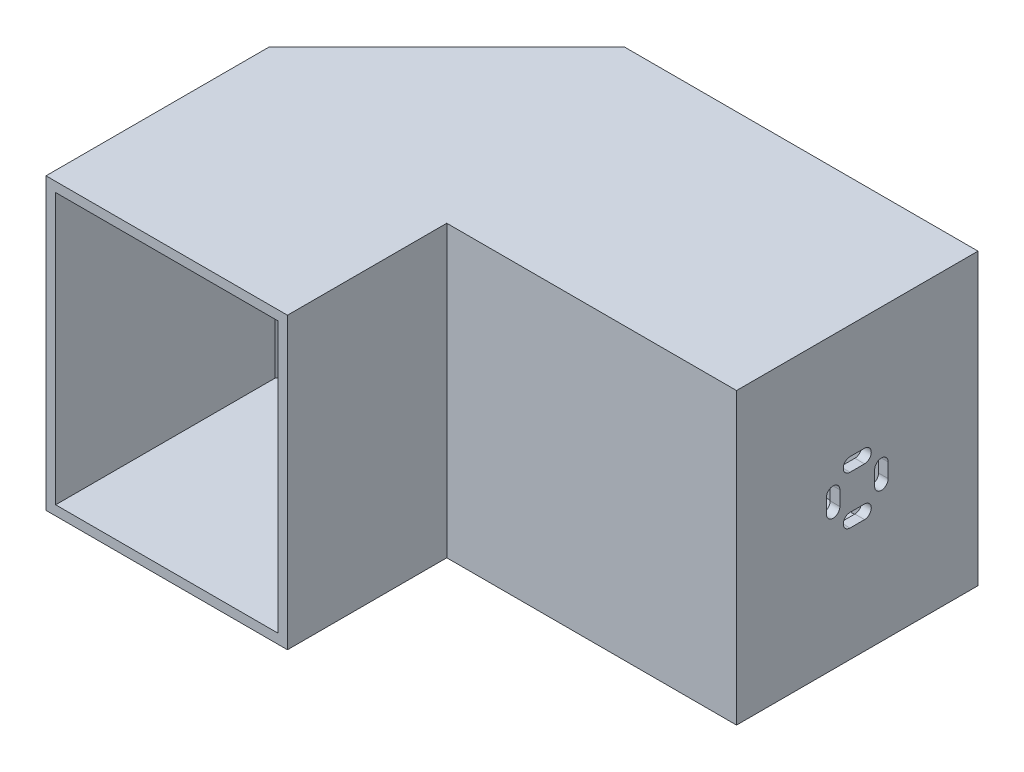
ISO-10303-21;
HEADER;
FILE_DESCRIPTION(('STEP AP214'),'2;1');
FILE_NAME('part.step','',(''),(''),'','','');
FILE_SCHEMA(('AUTOMOTIVE_DESIGN { 1 0 10303 214 1 1 1 1 }'));
ENDSEC;
DATA;
#1=APPLICATION_CONTEXT('core data for automotive mechanical design processes');
#2=APPLICATION_PROTOCOL_DEFINITION('international standard','automotive_design',2000,#1);
#3=PRODUCT_CONTEXT('',#1,'mechanical');
#4=PRODUCT('Part','Part','',(#3));
#5=PRODUCT_RELATED_PRODUCT_CATEGORY('part','',(#4));
#6=PRODUCT_DEFINITION_FORMATION('','',#4);
#7=PRODUCT_DEFINITION_CONTEXT('part definition',#1,'design');
#8=PRODUCT_DEFINITION('design','',#6,#7);
#9=PRODUCT_DEFINITION_SHAPE('','',#8);
#10=(LENGTH_UNIT() NAMED_UNIT(*) SI_UNIT(.MILLI.,.METRE.));
#11=(NAMED_UNIT(*) PLANE_ANGLE_UNIT() SI_UNIT($,.RADIAN.));
#12=(NAMED_UNIT(*) SI_UNIT($,.STERADIAN.) SOLID_ANGLE_UNIT());
#13=UNCERTAINTY_MEASURE_WITH_UNIT(LENGTH_MEASURE(1.E-05),#10,'distance_accuracy_value','');
#14=(GEOMETRIC_REPRESENTATION_CONTEXT(3) GLOBAL_UNCERTAINTY_ASSIGNED_CONTEXT((#13)) GLOBAL_UNIT_ASSIGNED_CONTEXT((#10,
#11,#12)) REPRESENTATION_CONTEXT('',''));
#15=CARTESIAN_POINT('',(0.,0.,0.));
#16=DIRECTION('',(0.,0.,1.));
#17=DIRECTION('',(1.,0.,0.));
#18=AXIS2_PLACEMENT_3D('',#15,#16,#17);
#19=CARTESIAN_POINT('',(0.,76.2,41.8923125117075));
#20=DIRECTION('',(0.,0.,-1.));
#21=DIRECTION('',(-1.,0.,0.));
#22=AXIS2_PLACEMENT_3D('',#19,#20,#21);
#23=PLANE('',#22);
#24=DIRECTION('',(1.,0.,0.));
#25=VECTOR('',#24,1.);
#26=CARTESIAN_POINT('',(0.,0.,41.8923125117075));
#27=LINE('',#26,#25);
#28=CARTESIAN_POINT('',(-63.5,0.,41.8923125117075));
#29=VERTEX_POINT('',#28);
#30=CARTESIAN_POINT('',(0.,0.,41.8923125117075));
#31=VERTEX_POINT('',#30);
#32=EDGE_CURVE('E445',#29,#31,#27,.T.);
#33=ORIENTED_EDGE('',*,*,#32,.T.);
#34=DIRECTION('',(0.,-1.,0.));
#35=VECTOR('',#34,1.);
#36=CARTESIAN_POINT('',(0.,76.2,41.8923125117075));
#37=LINE('',#36,#35);
#38=CARTESIAN_POINT('',(0.,76.2,41.8923125117075));
#39=VERTEX_POINT('',#38);
#40=EDGE_CURVE('E450',#39,#31,#37,.T.);
#41=ORIENTED_EDGE('',*,*,#40,.F.);
#42=DIRECTION('',(1.,0.,0.));
#43=VECTOR('',#42,1.);
#44=CARTESIAN_POINT('',(0.,76.2,41.8923125117075));
#45=LINE('',#44,#43);
#46=CARTESIAN_POINT('',(-63.5,76.2,41.8923125117075));
#47=VERTEX_POINT('',#46);
#48=EDGE_CURVE('E430',#47,#39,#45,.T.);
#49=ORIENTED_EDGE('',*,*,#48,.F.);
#50=DIRECTION('',(0.,-1.,0.));
#51=VECTOR('',#50,1.);
#52=CARTESIAN_POINT('',(-63.5,76.2,41.8923125117075));
#53=LINE('',#52,#51);
#54=EDGE_CURVE('E453',#47,#29,#53,.T.);
#55=ORIENTED_EDGE('',*,*,#54,.T.);
#56=EDGE_LOOP('',(#33,#41,#49,#55));
#57=FACE_BOUND('',#56,.T.);
#58=DIRECTION('',(1.,0.,0.));
#59=VECTOR('',#58,1.);
#60=CARTESIAN_POINT('',(0.,2.54,41.8923125117075));
#61=LINE('',#60,#59);
#62=CARTESIAN_POINT('',(-60.96,2.54,41.8923125117075));
#63=VERTEX_POINT('',#62);
#64=CARTESIAN_POINT('',(-2.53999999999997,2.54,41.8923125117075));
#65=VERTEX_POINT('',#64);
#66=EDGE_CURVE('E405',#63,#65,#61,.T.);
#67=ORIENTED_EDGE('',*,*,#66,.F.);
#68=DIRECTION('',(0.,-1.,0.));
#69=VECTOR('',#68,1.);
#70=CARTESIAN_POINT('',(-60.96,76.2,41.8923125117075));
#71=LINE('',#70,#69);
#72=CARTESIAN_POINT('',(-60.96,73.66,41.8923125117075));
#73=VERTEX_POINT('',#72);
#74=EDGE_CURVE('E401',#73,#63,#71,.T.);
#75=ORIENTED_EDGE('',*,*,#74,.F.);
#76=DIRECTION('',(1.,0.,0.));
#77=VECTOR('',#76,1.);
#78=CARTESIAN_POINT('',(0.,73.66,41.8923125117075));
#79=LINE('',#78,#77);
#80=CARTESIAN_POINT('',(-2.53999999999997,73.66,41.8923125117075));
#81=VERTEX_POINT('',#80);
#82=EDGE_CURVE('E408',#73,#81,#79,.T.);
#83=ORIENTED_EDGE('',*,*,#82,.T.);
#84=DIRECTION('',(0.,-1.,0.));
#85=VECTOR('',#84,1.);
#86=CARTESIAN_POINT('',(-2.53999999999997,76.2,41.8923125117075));
#87=LINE('',#86,#85);
#88=EDGE_CURVE('E381',#81,#65,#87,.T.);
#89=ORIENTED_EDGE('',*,*,#88,.T.);
#90=EDGE_LOOP('',(#67,#75,#83,#89));
#91=FACE_BOUND('',#90,.T.);
#92=ADVANCED_FACE('F35',(#57,#91),#23,.F.);
#93=CARTESIAN_POINT('',(76.2,76.2,0.));
#94=DIRECTION('',(0.,0.,-1.));
#95=DIRECTION('',(-1.,0.,0.));
#96=AXIS2_PLACEMENT_3D('',#93,#94,#95);
#97=PLANE('',#96);
#98=DIRECTION('',(1.,0.,0.));
#99=VECTOR('',#98,1.);
#100=CARTESIAN_POINT('',(76.2,0.,0.));
#101=LINE('',#100,#99);
#102=CARTESIAN_POINT('',(0.,0.,0.));
#103=VERTEX_POINT('',#102);
#104=CARTESIAN_POINT('',(76.2,0.,0.));
#105=VERTEX_POINT('',#104);
#106=EDGE_CURVE('E371',#103,#105,#101,.T.);
#107=ORIENTED_EDGE('',*,*,#106,.T.);
#108=DIRECTION('',(0.,-1.,0.));
#109=VECTOR('',#108,1.);
#110=CARTESIAN_POINT('',(76.2,76.2,0.));
#111=LINE('',#110,#109);
#112=CARTESIAN_POINT('',(76.2,76.2,0.));
#113=VERTEX_POINT('',#112);
#114=EDGE_CURVE('E11',#113,#105,#111,.T.);
#115=ORIENTED_EDGE('',*,*,#114,.F.);
#116=DIRECTION('',(1.,0.,0.));
#117=VECTOR('',#116,1.);
#118=CARTESIAN_POINT('',(76.2,76.2,0.));
#119=LINE('',#118,#117);
#120=CARTESIAN_POINT('',(0.,76.2,0.));
#121=VERTEX_POINT('',#120);
#122=EDGE_CURVE('E418',#121,#113,#119,.T.);
#123=ORIENTED_EDGE('',*,*,#122,.F.);
#124=DIRECTION('',(0.,-1.,0.));
#125=VECTOR('',#124,1.);
#126=CARTESIAN_POINT('',(0.,76.2,0.));
#127=LINE('',#126,#125);
#128=EDGE_CURVE('E434',#121,#103,#127,.T.);
#129=ORIENTED_EDGE('',*,*,#128,.T.);
#130=EDGE_LOOP('',(#107,#115,#123,#129));
#131=FACE_BOUND('',#130,.T.);
#132=ADVANCED_FACE('F37',(#131),#97,.F.);
#133=CARTESIAN_POINT('',(76.2,76.2,-63.5));
#134=DIRECTION('',(-1.,0.,0.));
#135=DIRECTION('',(0.,0.,1.));
#136=AXIS2_PLACEMENT_3D('',#133,#134,#135);
#137=PLANE('',#136);
#138=DIRECTION('',(0.,-1.,0.));
#139=VECTOR('',#138,1.);
#140=CARTESIAN_POINT('',(76.2,40.005,-36.322));
#141=LINE('',#140,#139);
#142=CARTESIAN_POINT('',(76.2,40.005,-36.322));
#143=VERTEX_POINT('',#142);
#144=CARTESIAN_POINT('',(76.2,36.1950000000001,-36.322));
#145=VERTEX_POINT('',#144);
#146=EDGE_CURVE('E259',#143,#145,#141,.T.);
#147=ORIENTED_EDGE('',*,*,#146,.F.);
#148=CARTESIAN_POINT('',(76.2,40.0050000000001,-38.1));
#149=DIRECTION('',(1.,0.,0.));
#150=DIRECTION('',(0.,-1.,0.));
#151=AXIS2_PLACEMENT_3D('',#148,#149,#150);
#152=CIRCLE('',#151,1.778);
#153=CARTESIAN_POINT('',(76.2,40.0050000000001,-39.878));
#154=VERTEX_POINT('',#153);
#155=EDGE_CURVE('E50',#154,#143,#152,.T.);
#156=ORIENTED_EDGE('',*,*,#155,.F.);
#157=DIRECTION('',(0.,1.,0.));
#158=VECTOR('',#157,1.);
#159=CARTESIAN_POINT('',(76.2,40.0050000000001,-39.878));
#160=LINE('',#159,#158);
#161=CARTESIAN_POINT('',(76.2,36.1950000000001,-39.878));
#162=VERTEX_POINT('',#161);
#163=EDGE_CURVE('E250',#162,#154,#160,.T.);
#164=ORIENTED_EDGE('',*,*,#163,.F.);
#165=CARTESIAN_POINT('',(76.2,36.1950000000001,-38.1));
#166=DIRECTION('',(1.,0.,0.));
#167=DIRECTION('',(0.,-1.,0.));
#168=AXIS2_PLACEMENT_3D('',#165,#166,#167);
#169=CIRCLE('',#168,1.778);
#170=EDGE_CURVE('E253',#145,#162,#169,.T.);
#171=ORIENTED_EDGE('',*,*,#170,.F.);
#172=EDGE_LOOP('',(#147,#156,#164,#171));
#173=FACE_BOUND('',#172,.T.);
#174=DIRECTION('',(0.,0.,1.));
#175=VECTOR('',#174,1.);
#176=CARTESIAN_POINT('',(76.2,33.528,-33.655));
#177=LINE('',#176,#175);
#178=CARTESIAN_POINT('',(76.2,33.528,-33.655));
#179=VERTEX_POINT('',#178);
#180=CARTESIAN_POINT('',(76.2,33.528,-29.845));
#181=VERTEX_POINT('',#180);
#182=EDGE_CURVE('E284',#179,#181,#177,.T.);
#183=ORIENTED_EDGE('',*,*,#182,.F.);
#184=CARTESIAN_POINT('',(76.2,31.75,-33.655));
#185=DIRECTION('',(1.,0.,0.));
#186=DIRECTION('',(0.,0.,1.));
#187=AXIS2_PLACEMENT_3D('',#184,#185,#186);
#188=CIRCLE('',#187,1.778);
#189=CARTESIAN_POINT('',(76.2,29.972,-33.655));
#190=VERTEX_POINT('',#189);
#191=EDGE_CURVE('E265',#190,#179,#188,.T.);
#192=ORIENTED_EDGE('',*,*,#191,.F.);
#193=DIRECTION('',(0.,0.,-1.));
#194=VECTOR('',#193,1.);
#195=CARTESIAN_POINT('',(76.2,29.972,-33.655));
#196=LINE('',#195,#194);
#197=CARTESIAN_POINT('',(76.2,29.972,-29.845));
#198=VERTEX_POINT('',#197);
#199=EDGE_CURVE('E273',#198,#190,#196,.T.);
#200=ORIENTED_EDGE('',*,*,#199,.F.);
#201=CARTESIAN_POINT('',(76.2,31.75,-29.845));
#202=DIRECTION('',(1.,0.,0.));
#203=DIRECTION('',(0.,0.,1.));
#204=AXIS2_PLACEMENT_3D('',#201,#202,#203);
#205=CIRCLE('',#204,1.778);
#206=EDGE_CURVE('E287',#181,#198,#205,.T.);
#207=ORIENTED_EDGE('',*,*,#206,.F.);
#208=EDGE_LOOP('',(#183,#192,#200,#207));
#209=FACE_BOUND('',#208,.T.);
#210=DIRECTION('',(0.,1.,0.));
#211=VECTOR('',#210,1.);
#212=CARTESIAN_POINT('',(76.2,36.195,-27.178));
#213=LINE('',#212,#211);
#214=CARTESIAN_POINT('',(76.2,36.195,-27.178));
#215=VERTEX_POINT('',#214);
#216=CARTESIAN_POINT('',(76.2,40.005,-27.178));
#217=VERTEX_POINT('',#216);
#218=EDGE_CURVE('E316',#215,#217,#213,.T.);
#219=ORIENTED_EDGE('',*,*,#218,.F.);
#220=CARTESIAN_POINT('',(76.2,36.195,-25.4));
#221=DIRECTION('',(1.,0.,0.));
#222=DIRECTION('',(0.,1.,0.));
#223=AXIS2_PLACEMENT_3D('',#220,#221,#222);
#224=CIRCLE('',#223,1.778);
#225=CARTESIAN_POINT('',(76.2,36.195,-23.622));
#226=VERTEX_POINT('',#225);
#227=EDGE_CURVE('E294',#226,#215,#224,.T.);
#228=ORIENTED_EDGE('',*,*,#227,.F.);
#229=DIRECTION('',(0.,-1.,0.));
#230=VECTOR('',#229,1.);
#231=CARTESIAN_POINT('',(76.2,36.195,-23.622));
#232=LINE('',#231,#230);
#233=CARTESIAN_POINT('',(76.2,40.005,-23.622));
#234=VERTEX_POINT('',#233);
#235=EDGE_CURVE('E305',#234,#226,#232,.T.);
#236=ORIENTED_EDGE('',*,*,#235,.F.);
#237=CARTESIAN_POINT('',(76.2,40.005,-25.4));
#238=DIRECTION('',(1.,0.,0.));
#239=DIRECTION('',(0.,1.,0.));
#240=AXIS2_PLACEMENT_3D('',#237,#238,#239);
#241=CIRCLE('',#240,1.778);
#242=EDGE_CURVE('E319',#217,#234,#241,.T.);
#243=ORIENTED_EDGE('',*,*,#242,.F.);
#244=EDGE_LOOP('',(#219,#228,#236,#243));
#245=FACE_BOUND('',#244,.T.);
#246=DIRECTION('',(0.,0.,-1.));
#247=VECTOR('',#246,1.);
#248=CARTESIAN_POINT('',(76.2,42.672,-29.845));
#249=LINE('',#248,#247);
#250=CARTESIAN_POINT('',(76.2,42.672,-29.845));
#251=VERTEX_POINT('',#250);
#252=CARTESIAN_POINT('',(76.2,42.672,-33.655));
#253=VERTEX_POINT('',#252);
#254=EDGE_CURVE('E348',#251,#253,#249,.T.);
#255=ORIENTED_EDGE('',*,*,#254,.F.);
#256=CARTESIAN_POINT('',(76.2,44.45,-29.845));
#257=DIRECTION('',(1.,0.,0.));
#258=DIRECTION('',(0.,0.,-1.));
#259=AXIS2_PLACEMENT_3D('',#256,#257,#258);
#260=CIRCLE('',#259,1.778);
#261=CARTESIAN_POINT('',(76.2,46.228,-29.845));
#262=VERTEX_POINT('',#261);
#263=EDGE_CURVE('E326',#262,#251,#260,.T.);
#264=ORIENTED_EDGE('',*,*,#263,.F.);
#265=DIRECTION('',(0.,0.,1.));
#266=VECTOR('',#265,1.);
#267=CARTESIAN_POINT('',(76.2,46.228,-29.845));
#268=LINE('',#267,#266);
#269=CARTESIAN_POINT('',(76.2,46.228,-33.655));
#270=VERTEX_POINT('',#269);
#271=EDGE_CURVE('E337',#270,#262,#268,.T.);
#272=ORIENTED_EDGE('',*,*,#271,.F.);
#273=CARTESIAN_POINT('',(76.2,44.45,-33.655));
#274=DIRECTION('',(1.,0.,0.));
#275=DIRECTION('',(0.,0.,-1.));
#276=AXIS2_PLACEMENT_3D('',#273,#274,#275);
#277=CIRCLE('',#276,1.778);
#278=EDGE_CURVE('E351',#253,#270,#277,.T.);
#279=ORIENTED_EDGE('',*,*,#278,.F.);
#280=EDGE_LOOP('',(#255,#264,#272,#279));
#281=FACE_BOUND('',#280,.T.);
#282=DIRECTION('',(0.,0.,-1.));
#283=VECTOR('',#282,1.);
#284=CARTESIAN_POINT('',(76.2,0.,-63.5));
#285=LINE('',#284,#283);
#286=CARTESIAN_POINT('',(76.2,0.,-63.5));
#287=VERTEX_POINT('',#286);
#288=EDGE_CURVE('E437',#105,#287,#285,.T.);
#289=ORIENTED_EDGE('',*,*,#288,.T.);
#290=DIRECTION('',(0.,-1.,0.));
#291=VECTOR('',#290,1.);
#292=CARTESIAN_POINT('',(76.2,76.2,-63.5));
#293=LINE('',#292,#291);
#294=CARTESIAN_POINT('',(76.2,76.2,-63.5));
#295=VERTEX_POINT('',#294);
#296=EDGE_CURVE('E43',#295,#287,#293,.T.);
#297=ORIENTED_EDGE('',*,*,#296,.F.);
#298=DIRECTION('',(0.,0.,-1.));
#299=VECTOR('',#298,1.);
#300=CARTESIAN_POINT('',(76.2,76.2,-63.5));
#301=LINE('',#300,#299);
#302=EDGE_CURVE('E421',#113,#295,#301,.T.);
#303=ORIENTED_EDGE('',*,*,#302,.F.);
#304=ORIENTED_EDGE('',*,*,#114,.T.);
#305=EDGE_LOOP('',(#289,#297,#303,#304));
#306=FACE_BOUND('',#305,.T.);
#307=ADVANCED_FACE('F489',(#173,#209,#245,#281,#306),#137,.F.);
#308=CARTESIAN_POINT('',(-16.8229138853431,76.2,-63.5));
#309=DIRECTION('',(0.,0.,1.));
#310=DIRECTION('',(1.,0.,0.));
#311=AXIS2_PLACEMENT_3D('',#308,#309,#310);
#312=PLANE('',#311);
#313=DIRECTION('',(-1.,0.,0.));
#314=VECTOR('',#313,1.);
#315=CARTESIAN_POINT('',(-16.8229138853431,0.,-63.5));
#316=LINE('',#315,#314);
#317=CARTESIAN_POINT('',(-16.8229138853431,0.,-63.5));
#318=VERTEX_POINT('',#317);
#319=EDGE_CURVE('E439',#287,#318,#316,.T.);
#320=ORIENTED_EDGE('',*,*,#319,.T.);
#321=DIRECTION('',(0.,-1.,0.));
#322=VECTOR('',#321,1.);
#323=CARTESIAN_POINT('',(-16.8229138853431,76.2,-63.5));
#324=LINE('',#323,#322);
#325=CARTESIAN_POINT('',(-16.8229138853431,76.2,-63.5));
#326=VERTEX_POINT('',#325);
#327=EDGE_CURVE('E459',#326,#318,#324,.T.);
#328=ORIENTED_EDGE('',*,*,#327,.F.);
#329=DIRECTION('',(-1.,0.,0.));
#330=VECTOR('',#329,1.);
#331=CARTESIAN_POINT('',(-16.8229138853431,76.2,-63.5));
#332=LINE('',#331,#330);
#333=EDGE_CURVE('E424',#295,#326,#332,.T.);
#334=ORIENTED_EDGE('',*,*,#333,.F.);
#335=ORIENTED_EDGE('',*,*,#296,.T.);
#336=EDGE_LOOP('',(#320,#328,#334,#335));
#337=FACE_BOUND('',#336,.T.);
#338=ADVANCED_FACE('F466',(#337),#312,.F.);
#339=CARTESIAN_POINT('',(-63.5,76.2,-16.822913885342));
#340=DIRECTION('',(0.707106781186556,0.,0.707106781186539));
#341=DIRECTION('',(0.707106781186539,0.,-0.707106781186556));
#342=AXIS2_PLACEMENT_3D('',#339,#340,#341);
#343=PLANE('',#342);
#344=DIRECTION('',(-0.707106781186539,0.,0.707106781186556));
#345=VECTOR('',#344,1.);
#346=CARTESIAN_POINT('',(-63.5,0.,-16.822913885342));
#347=LINE('',#346,#345);
#348=CARTESIAN_POINT('',(-63.5,0.,-16.822913885342));
#349=VERTEX_POINT('',#348);
#350=EDGE_CURVE('E441',#318,#349,#347,.T.);
#351=ORIENTED_EDGE('',*,*,#350,.T.);
#352=DIRECTION('',(0.,-1.,0.));
#353=VECTOR('',#352,1.);
#354=CARTESIAN_POINT('',(-63.5,76.2,-16.822913885342));
#355=LINE('',#354,#353);
#356=CARTESIAN_POINT('',(-63.5,76.2,-16.822913885342));
#357=VERTEX_POINT('',#356);
#358=EDGE_CURVE('E456',#357,#349,#355,.T.);
#359=ORIENTED_EDGE('',*,*,#358,.F.);
#360=DIRECTION('',(-0.707106781186539,0.,0.707106781186556));
#361=VECTOR('',#360,1.);
#362=CARTESIAN_POINT('',(-63.5,76.2,-16.822913885342));
#363=LINE('',#362,#361);
#364=EDGE_CURVE('E426',#326,#357,#363,.T.);
#365=ORIENTED_EDGE('',*,*,#364,.F.);
#366=ORIENTED_EDGE('',*,*,#327,.T.);
#367=EDGE_LOOP('',(#351,#359,#365,#366));
#368=FACE_BOUND('',#367,.T.);
#369=ADVANCED_FACE('F477',(#368),#343,.F.);
#370=CARTESIAN_POINT('',(-63.5,76.2,41.8923125117075));
#371=DIRECTION('',(1.,0.,0.));
#372=DIRECTION('',(0.,0.,-1.));
#373=AXIS2_PLACEMENT_3D('',#370,#371,#372);
#374=PLANE('',#373);
#375=DIRECTION('',(0.,0.,1.));
#376=VECTOR('',#375,1.);
#377=CARTESIAN_POINT('',(-63.5,0.,41.8923125117075));
#378=LINE('',#377,#376);
#379=EDGE_CURVE('E443',#349,#29,#378,.T.);
#380=ORIENTED_EDGE('',*,*,#379,.T.);
#381=ORIENTED_EDGE('',*,*,#54,.F.);
#382=DIRECTION('',(0.,0.,1.));
#383=VECTOR('',#382,1.);
#384=CARTESIAN_POINT('',(-63.5,76.2,41.8923125117075));
#385=LINE('',#384,#383);
#386=EDGE_CURVE('E428',#357,#47,#385,.T.);
#387=ORIENTED_EDGE('',*,*,#386,.F.);
#388=ORIENTED_EDGE('',*,*,#358,.T.);
#389=EDGE_LOOP('',(#380,#381,#387,#388));
#390=FACE_BOUND('',#389,.T.);
#391=ADVANCED_FACE('F481',(#390),#374,.F.);
#392=CARTESIAN_POINT('',(0.,76.2,0.));
#393=DIRECTION('',(-1.,0.,0.));
#394=DIRECTION('',(0.,0.,1.));
#395=AXIS2_PLACEMENT_3D('',#392,#393,#394);
#396=PLANE('',#395);
#397=DIRECTION('',(0.,0.,-1.));
#398=VECTOR('',#397,1.);
#399=CARTESIAN_POINT('',(0.,0.,0.));
#400=LINE('',#399,#398);
#401=EDGE_CURVE('E422',#31,#103,#400,.T.);
#402=ORIENTED_EDGE('',*,*,#401,.T.);
#403=ORIENTED_EDGE('',*,*,#128,.F.);
#404=DIRECTION('',(0.,0.,-1.));
#405=VECTOR('',#404,1.);
#406=CARTESIAN_POINT('',(0.,76.2,0.));
#407=LINE('',#406,#405);
#408=EDGE_CURVE('E432',#39,#121,#407,.T.);
#409=ORIENTED_EDGE('',*,*,#408,.F.);
#410=ORIENTED_EDGE('',*,*,#40,.T.);
#411=EDGE_LOOP('',(#402,#403,#409,#410));
#412=FACE_BOUND('',#411,.T.);
#413=ADVANCED_FACE('F494',(#412),#396,.F.);
#414=CARTESIAN_POINT('',(0.,76.2,0.));
#415=DIRECTION('',(0.,1.,0.));
#416=DIRECTION('',(0.,0.,1.));
#417=AXIS2_PLACEMENT_3D('',#414,#415,#416);
#418=PLANE('',#417);
#419=ORIENTED_EDGE('',*,*,#122,.T.);
#420=ORIENTED_EDGE('',*,*,#302,.T.);
#421=ORIENTED_EDGE('',*,*,#333,.T.);
#422=ORIENTED_EDGE('',*,*,#364,.T.);
#423=ORIENTED_EDGE('',*,*,#386,.T.);
#424=ORIENTED_EDGE('',*,*,#48,.T.);
#425=ORIENTED_EDGE('',*,*,#408,.T.);
#426=EDGE_LOOP('',(#419,#420,#421,#422,#423,#424,#425));
#427=FACE_BOUND('',#426,.T.);
#428=ADVANCED_FACE('F485',(#427),#418,.T.);
#429=CARTESIAN_POINT('',(0.,0.,0.));
#430=DIRECTION('',(0.,1.,0.));
#431=DIRECTION('',(0.,0.,1.));
#432=AXIS2_PLACEMENT_3D('',#429,#430,#431);
#433=PLANE('',#432);
#434=ORIENTED_EDGE('',*,*,#106,.F.);
#435=ORIENTED_EDGE('',*,*,#401,.F.);
#436=ORIENTED_EDGE('',*,*,#32,.F.);
#437=ORIENTED_EDGE('',*,*,#379,.F.);
#438=ORIENTED_EDGE('',*,*,#350,.F.);
#439=ORIENTED_EDGE('',*,*,#319,.F.);
#440=ORIENTED_EDGE('',*,*,#288,.F.);
#441=EDGE_LOOP('',(#434,#435,#436,#437,#438,#439,#440));
#442=FACE_BOUND('',#441,.T.);
#443=ADVANCED_FACE('F472',(#442),#433,.F.);
#444=CARTESIAN_POINT('',(76.2,76.2,-2.54));
#445=DIRECTION('',(0.,0.,-1.));
#446=DIRECTION('',(-1.,0.,0.));
#447=AXIS2_PLACEMENT_3D('',#444,#445,#446);
#448=PLANE('',#447);
#449=DIRECTION('',(1.,0.,0.));
#450=VECTOR('',#449,1.);
#451=CARTESIAN_POINT('',(76.2,2.54,-2.54));
#452=LINE('',#451,#450);
#453=CARTESIAN_POINT('',(-2.54,2.54,-2.54));
#454=VERTEX_POINT('',#453);
#455=CARTESIAN_POINT('',(73.66,2.54,-2.54));
#456=VERTEX_POINT('',#455);
#457=EDGE_CURVE('E358',#454,#456,#452,.T.);
#458=ORIENTED_EDGE('',*,*,#457,.F.);
#459=DIRECTION('',(0.,-1.,0.));
#460=VECTOR('',#459,1.);
#461=CARTESIAN_POINT('',(-2.54,76.2,-2.54));
#462=LINE('',#461,#460);
#463=CARTESIAN_POINT('',(-2.54,73.66,-2.54));
#464=VERTEX_POINT('',#463);
#465=EDGE_CURVE('E378',#464,#454,#462,.T.);
#466=ORIENTED_EDGE('',*,*,#465,.F.);
#467=DIRECTION('',(1.,0.,0.));
#468=VECTOR('',#467,1.);
#469=CARTESIAN_POINT('',(76.2,73.66,-2.54));
#470=LINE('',#469,#468);
#471=CARTESIAN_POINT('',(73.66,73.66,-2.54));
#472=VERTEX_POINT('',#471);
#473=EDGE_CURVE('E373',#464,#472,#470,.T.);
#474=ORIENTED_EDGE('',*,*,#473,.T.);
#475=DIRECTION('',(0.,-1.,0.));
#476=VECTOR('',#475,1.);
#477=CARTESIAN_POINT('',(73.66,76.2,-2.54));
#478=LINE('',#477,#476);
#479=EDGE_CURVE('E368',#472,#456,#478,.T.);
#480=ORIENTED_EDGE('',*,*,#479,.T.);
#481=EDGE_LOOP('',(#458,#466,#474,#480));
#482=FACE_BOUND('',#481,.T.);
#483=ADVANCED_FACE('F513',(#482),#448,.T.);
#484=CARTESIAN_POINT('',(73.66,76.2,-63.5));
#485=DIRECTION('',(-1.,0.,0.));
#486=DIRECTION('',(0.,0.,1.));
#487=AXIS2_PLACEMENT_3D('',#484,#485,#486);
#488=PLANE('',#487);
#489=CARTESIAN_POINT('',(73.66,40.0050000000001,-38.1));
#490=DIRECTION('',(1.,0.,0.));
#491=DIRECTION('',(0.,-1.,0.));
#492=AXIS2_PLACEMENT_3D('',#489,#490,#491);
#493=CIRCLE('',#492,1.778);
#494=CARTESIAN_POINT('',(73.66,40.0050000000001,-39.878));
#495=VERTEX_POINT('',#494);
#496=CARTESIAN_POINT('',(73.66,40.005,-36.322));
#497=VERTEX_POINT('',#496);
#498=EDGE_CURVE('E234',#495,#497,#493,.T.);
#499=ORIENTED_EDGE('',*,*,#498,.T.);
#500=DIRECTION('',(0.,-1.,0.));
#501=VECTOR('',#500,1.);
#502=CARTESIAN_POINT('',(73.66,40.005,-36.322));
#503=LINE('',#502,#501);
#504=CARTESIAN_POINT('',(73.66,36.1950000000001,-36.322));
#505=VERTEX_POINT('',#504);
#506=EDGE_CURVE('E243',#497,#505,#503,.T.);
#507=ORIENTED_EDGE('',*,*,#506,.T.);
#508=CARTESIAN_POINT('',(73.66,36.1950000000001,-38.1));
#509=DIRECTION('',(1.,0.,0.));
#510=DIRECTION('',(0.,-1.,0.));
#511=AXIS2_PLACEMENT_3D('',#508,#509,#510);
#512=CIRCLE('',#511,1.778);
#513=CARTESIAN_POINT('',(73.66,36.1950000000001,-39.878));
#514=VERTEX_POINT('',#513);
#515=EDGE_CURVE('E58',#505,#514,#512,.T.);
#516=ORIENTED_EDGE('',*,*,#515,.T.);
#517=DIRECTION('',(0.,1.,0.));
#518=VECTOR('',#517,1.);
#519=CARTESIAN_POINT('',(73.66,40.0050000000001,-39.878));
#520=LINE('',#519,#518);
#521=EDGE_CURVE('E240',#514,#495,#520,.T.);
#522=ORIENTED_EDGE('',*,*,#521,.T.);
#523=EDGE_LOOP('',(#499,#507,#516,#522));
#524=FACE_BOUND('',#523,.T.);
#525=CARTESIAN_POINT('',(73.66,31.75,-33.655));
#526=DIRECTION('',(1.,0.,0.));
#527=DIRECTION('',(0.,0.,1.));
#528=AXIS2_PLACEMENT_3D('',#525,#526,#527);
#529=CIRCLE('',#528,1.778);
#530=CARTESIAN_POINT('',(73.66,29.972,-33.655));
#531=VERTEX_POINT('',#530);
#532=CARTESIAN_POINT('',(73.66,33.528,-33.655));
#533=VERTEX_POINT('',#532);
#534=EDGE_CURVE('E269',#531,#533,#529,.T.);
#535=ORIENTED_EDGE('',*,*,#534,.T.);
#536=DIRECTION('',(0.,0.,1.));
#537=VECTOR('',#536,1.);
#538=CARTESIAN_POINT('',(73.66,33.528,-33.655));
#539=LINE('',#538,#537);
#540=CARTESIAN_POINT('',(73.66,33.528,-29.845));
#541=VERTEX_POINT('',#540);
#542=EDGE_CURVE('E272',#533,#541,#539,.T.);
#543=ORIENTED_EDGE('',*,*,#542,.T.);
#544=CARTESIAN_POINT('',(73.66,31.75,-29.845));
#545=DIRECTION('',(1.,0.,0.));
#546=DIRECTION('',(0.,0.,1.));
#547=AXIS2_PLACEMENT_3D('',#544,#545,#546);
#548=CIRCLE('',#547,1.778);
#549=CARTESIAN_POINT('',(73.66,29.972,-29.845));
#550=VERTEX_POINT('',#549);
#551=EDGE_CURVE('E276',#541,#550,#548,.T.);
#552=ORIENTED_EDGE('',*,*,#551,.T.);
#553=DIRECTION('',(0.,0.,-1.));
#554=VECTOR('',#553,1.);
#555=CARTESIAN_POINT('',(73.66,29.972,-33.655));
#556=LINE('',#555,#554);
#557=EDGE_CURVE('E279',#550,#531,#556,.T.);
#558=ORIENTED_EDGE('',*,*,#557,.T.);
#559=EDGE_LOOP('',(#535,#543,#552,#558));
#560=FACE_BOUND('',#559,.T.);
#561=CARTESIAN_POINT('',(73.66,36.195,-25.4));
#562=DIRECTION('',(1.,0.,0.));
#563=DIRECTION('',(0.,1.,0.));
#564=AXIS2_PLACEMENT_3D('',#561,#562,#563);
#565=CIRCLE('',#564,1.778);
#566=CARTESIAN_POINT('',(73.66,36.195,-23.622));
#567=VERTEX_POINT('',#566);
#568=CARTESIAN_POINT('',(73.66,36.195,-27.178));
#569=VERTEX_POINT('',#568);
#570=EDGE_CURVE('E301',#567,#569,#565,.T.);
#571=ORIENTED_EDGE('',*,*,#570,.T.);
#572=DIRECTION('',(0.,1.,0.));
#573=VECTOR('',#572,1.);
#574=CARTESIAN_POINT('',(73.66,36.195,-27.178));
#575=LINE('',#574,#573);
#576=CARTESIAN_POINT('',(73.66,40.005,-27.178));
#577=VERTEX_POINT('',#576);
#578=EDGE_CURVE('E304',#569,#577,#575,.T.);
#579=ORIENTED_EDGE('',*,*,#578,.T.);
#580=CARTESIAN_POINT('',(73.66,40.005,-25.4));
#581=DIRECTION('',(1.,0.,0.));
#582=DIRECTION('',(0.,1.,0.));
#583=AXIS2_PLACEMENT_3D('',#580,#581,#582);
#584=CIRCLE('',#583,1.778);
#585=CARTESIAN_POINT('',(73.66,40.005,-23.622));
#586=VERTEX_POINT('',#585);
#587=EDGE_CURVE('E308',#577,#586,#584,.T.);
#588=ORIENTED_EDGE('',*,*,#587,.T.);
#589=DIRECTION('',(0.,-1.,0.));
#590=VECTOR('',#589,1.);
#591=CARTESIAN_POINT('',(73.66,36.195,-23.622));
#592=LINE('',#591,#590);
#593=EDGE_CURVE('E311',#586,#567,#592,.T.);
#594=ORIENTED_EDGE('',*,*,#593,.T.);
#595=EDGE_LOOP('',(#571,#579,#588,#594));
#596=FACE_BOUND('',#595,.T.);
#597=CARTESIAN_POINT('',(73.66,44.45,-29.845));
#598=DIRECTION('',(1.,0.,0.));
#599=DIRECTION('',(0.,0.,-1.));
#600=AXIS2_PLACEMENT_3D('',#597,#598,#599);
#601=CIRCLE('',#600,1.778);
#602=CARTESIAN_POINT('',(73.66,46.228,-29.845));
#603=VERTEX_POINT('',#602);
#604=CARTESIAN_POINT('',(73.66,42.672,-29.845));
#605=VERTEX_POINT('',#604);
#606=EDGE_CURVE('E333',#603,#605,#601,.T.);
#607=ORIENTED_EDGE('',*,*,#606,.T.);
#608=DIRECTION('',(0.,0.,-1.));
#609=VECTOR('',#608,1.);
#610=CARTESIAN_POINT('',(73.66,42.672,-29.845));
#611=LINE('',#610,#609);
#612=CARTESIAN_POINT('',(73.66,42.672,-33.655));
#613=VERTEX_POINT('',#612);
#614=EDGE_CURVE('E336',#605,#613,#611,.T.);
#615=ORIENTED_EDGE('',*,*,#614,.T.);
#616=CARTESIAN_POINT('',(73.66,44.45,-33.655));
#617=DIRECTION('',(1.,0.,0.));
#618=DIRECTION('',(0.,0.,-1.));
#619=AXIS2_PLACEMENT_3D('',#616,#617,#618);
#620=CIRCLE('',#619,1.778);
#621=CARTESIAN_POINT('',(73.66,46.228,-33.655));
#622=VERTEX_POINT('',#621);
#623=EDGE_CURVE('E340',#613,#622,#620,.T.);
#624=ORIENTED_EDGE('',*,*,#623,.T.);
#625=DIRECTION('',(0.,0.,1.));
#626=VECTOR('',#625,1.);
#627=CARTESIAN_POINT('',(73.66,46.228,-29.845));
#628=LINE('',#627,#626);
#629=EDGE_CURVE('E343',#622,#603,#628,.T.);
#630=ORIENTED_EDGE('',*,*,#629,.T.);
#631=EDGE_LOOP('',(#607,#615,#624,#630));
#632=FACE_BOUND('',#631,.T.);
#633=DIRECTION('',(0.,0.,-1.));
#634=VECTOR('',#633,1.);
#635=CARTESIAN_POINT('',(73.66,2.54,-63.5));
#636=LINE('',#635,#634);
#637=CARTESIAN_POINT('',(73.66,2.54,-60.96));
#638=VERTEX_POINT('',#637);
#639=EDGE_CURVE('E367',#456,#638,#636,.T.);
#640=ORIENTED_EDGE('',*,*,#639,.F.);
#641=ORIENTED_EDGE('',*,*,#479,.F.);
#642=DIRECTION('',(0.,0.,-1.));
#643=VECTOR('',#642,1.);
#644=CARTESIAN_POINT('',(73.66,73.66,-63.5));
#645=LINE('',#644,#643);
#646=CARTESIAN_POINT('',(73.66,73.66,-60.96));
#647=VERTEX_POINT('',#646);
#648=EDGE_CURVE('E376',#472,#647,#645,.T.);
#649=ORIENTED_EDGE('',*,*,#648,.T.);
#650=DIRECTION('',(0.,-1.,0.));
#651=VECTOR('',#650,1.);
#652=CARTESIAN_POINT('',(73.66,76.2,-60.96));
#653=LINE('',#652,#651);
#654=EDGE_CURVE('E372',#647,#638,#653,.T.);
#655=ORIENTED_EDGE('',*,*,#654,.T.);
#656=EDGE_LOOP('',(#640,#641,#649,#655));
#657=FACE_BOUND('',#656,.T.);
#658=ADVANCED_FACE('F247',(#524,#560,#596,#632,#657),#488,.T.);
#659=CARTESIAN_POINT('',(-16.8229138853431,76.2,-60.96));
#660=DIRECTION('',(0.,0.,1.));
#661=DIRECTION('',(1.,0.,0.));
#662=AXIS2_PLACEMENT_3D('',#659,#660,#661);
#663=PLANE('',#662);
#664=DIRECTION('',(-1.,0.,0.));
#665=VECTOR('',#664,1.);
#666=CARTESIAN_POINT('',(-16.8229138853431,2.54,-60.96));
#667=LINE('',#666,#665);
#668=CARTESIAN_POINT('',(-15.7708114369154,2.54,-60.96));
#669=VERTEX_POINT('',#668);
#670=EDGE_CURVE('E384',#638,#669,#667,.T.);
#671=ORIENTED_EDGE('',*,*,#670,.F.);
#672=ORIENTED_EDGE('',*,*,#654,.F.);
#673=DIRECTION('',(-1.,0.,0.));
#674=VECTOR('',#673,1.);
#675=CARTESIAN_POINT('',(-16.8229138853431,73.66,-60.96));
#676=LINE('',#675,#674);
#677=CARTESIAN_POINT('',(-15.7708114369154,73.66,-60.96));
#678=VERTEX_POINT('',#677);
#679=EDGE_CURVE('E389',#647,#678,#676,.T.);
#680=ORIENTED_EDGE('',*,*,#679,.T.);
#681=DIRECTION('',(0.,-1.,0.));
#682=VECTOR('',#681,1.);
#683=CARTESIAN_POINT('',(-15.7708114369154,76.2,-60.96));
#684=LINE('',#683,#682);
#685=EDGE_CURVE('E387',#678,#669,#684,.T.);
#686=ORIENTED_EDGE('',*,*,#685,.T.);
#687=EDGE_LOOP('',(#671,#672,#680,#686));
#688=FACE_BOUND('',#687,.T.);
#689=ADVANCED_FACE('F520',(#688),#663,.T.);
#690=CARTESIAN_POINT('',(-61.7039487757861,76.2,-15.0268626611282));
#691=DIRECTION('',(0.707106781186556,0.,0.707106781186539));
#692=DIRECTION('',(0.707106781186539,0.,-0.707106781186556));
#693=AXIS2_PLACEMENT_3D('',#690,#691,#692);
#694=PLANE('',#693);
#695=DIRECTION('',(-0.707106781186539,0.,0.707106781186556));
#696=VECTOR('',#695,1.);
#697=CARTESIAN_POINT('',(-61.7039487757861,2.54,-15.0268626611282));
#698=LINE('',#697,#696);
#699=CARTESIAN_POINT('',(-60.96,2.54,-15.7708114369143));
#700=VERTEX_POINT('',#699);
#701=EDGE_CURVE('E391',#669,#700,#698,.T.);
#702=ORIENTED_EDGE('',*,*,#701,.F.);
#703=ORIENTED_EDGE('',*,*,#685,.F.);
#704=DIRECTION('',(-0.707106781186539,0.,0.707106781186556));
#705=VECTOR('',#704,1.);
#706=CARTESIAN_POINT('',(-61.7039487757861,73.66,-15.0268626611282));
#707=LINE('',#706,#705);
#708=CARTESIAN_POINT('',(-60.96,73.66,-15.7708114369143));
#709=VERTEX_POINT('',#708);
#710=EDGE_CURVE('E396',#678,#709,#707,.T.);
#711=ORIENTED_EDGE('',*,*,#710,.T.);
#712=DIRECTION('',(0.,-1.,0.));
#713=VECTOR('',#712,1.);
#714=CARTESIAN_POINT('',(-60.96,76.2,-15.7708114369143));
#715=LINE('',#714,#713);
#716=EDGE_CURVE('E394',#709,#700,#715,.T.);
#717=ORIENTED_EDGE('',*,*,#716,.T.);
#718=EDGE_LOOP('',(#702,#703,#711,#717));
#719=FACE_BOUND('',#718,.T.);
#720=ADVANCED_FACE('F525',(#719),#694,.T.);
#721=CARTESIAN_POINT('',(-60.96,76.2,41.8923125117075));
#722=DIRECTION('',(1.,0.,0.));
#723=DIRECTION('',(0.,0.,-1.));
#724=AXIS2_PLACEMENT_3D('',#721,#722,#723);
#725=PLANE('',#724);
#726=DIRECTION('',(0.,0.,1.));
#727=VECTOR('',#726,1.);
#728=CARTESIAN_POINT('',(-60.96,2.54,41.8923125117075));
#729=LINE('',#728,#727);
#730=EDGE_CURVE('E398',#700,#63,#729,.T.);
#731=ORIENTED_EDGE('',*,*,#730,.F.);
#732=ORIENTED_EDGE('',*,*,#716,.F.);
#733=DIRECTION('',(0.,0.,1.));
#734=VECTOR('',#733,1.);
#735=CARTESIAN_POINT('',(-60.96,73.66,41.8923125117075));
#736=LINE('',#735,#734);
#737=EDGE_CURVE('E403',#709,#73,#736,.T.);
#738=ORIENTED_EDGE('',*,*,#737,.T.);
#739=ORIENTED_EDGE('',*,*,#74,.T.);
#740=EDGE_LOOP('',(#731,#732,#738,#739));
#741=FACE_BOUND('',#740,.T.);
#742=ADVANCED_FACE('F529',(#741),#725,.T.);
#743=CARTESIAN_POINT('',(-2.54,76.2,0.));
#744=DIRECTION('',(-1.,0.,0.));
#745=DIRECTION('',(0.,0.,1.));
#746=AXIS2_PLACEMENT_3D('',#743,#744,#745);
#747=PLANE('',#746);
#748=DIRECTION('',(0.,0.,-1.));
#749=VECTOR('',#748,1.);
#750=CARTESIAN_POINT('',(-2.54,2.54,0.));
#751=LINE('',#750,#749);
#752=EDGE_CURVE('E377',#65,#454,#751,.T.);
#753=ORIENTED_EDGE('',*,*,#752,.F.);
#754=ORIENTED_EDGE('',*,*,#88,.F.);
#755=DIRECTION('',(0.,0.,-1.));
#756=VECTOR('',#755,1.);
#757=CARTESIAN_POINT('',(-2.54,73.66,0.));
#758=LINE('',#757,#756);
#759=EDGE_CURVE('E382',#81,#464,#758,.T.);
#760=ORIENTED_EDGE('',*,*,#759,.T.);
#761=ORIENTED_EDGE('',*,*,#465,.T.);
#762=EDGE_LOOP('',(#753,#754,#760,#761));
#763=FACE_BOUND('',#762,.T.);
#764=ADVANCED_FACE('F507',(#763),#747,.T.);
#765=CARTESIAN_POINT('',(0.,73.66,0.));
#766=DIRECTION('',(0.,1.,0.));
#767=DIRECTION('',(0.,0.,1.));
#768=AXIS2_PLACEMENT_3D('',#765,#766,#767);
#769=PLANE('',#768);
#770=ORIENTED_EDGE('',*,*,#473,.F.);
#771=ORIENTED_EDGE('',*,*,#759,.F.);
#772=ORIENTED_EDGE('',*,*,#82,.F.);
#773=ORIENTED_EDGE('',*,*,#737,.F.);
#774=ORIENTED_EDGE('',*,*,#710,.F.);
#775=ORIENTED_EDGE('',*,*,#679,.F.);
#776=ORIENTED_EDGE('',*,*,#648,.F.);
#777=EDGE_LOOP('',(#770,#771,#772,#773,#774,#775,#776));
#778=FACE_BOUND('',#777,.T.);
#779=ADVANCED_FACE('F531',(#778),#769,.F.);
#780=CARTESIAN_POINT('',(0.,2.54,0.));
#781=DIRECTION('',(0.,1.,0.));
#782=DIRECTION('',(0.,0.,1.));
#783=AXIS2_PLACEMENT_3D('',#780,#781,#782);
#784=PLANE('',#783);
#785=ORIENTED_EDGE('',*,*,#457,.T.);
#786=ORIENTED_EDGE('',*,*,#639,.T.);
#787=ORIENTED_EDGE('',*,*,#670,.T.);
#788=ORIENTED_EDGE('',*,*,#701,.T.);
#789=ORIENTED_EDGE('',*,*,#730,.T.);
#790=ORIENTED_EDGE('',*,*,#66,.T.);
#791=ORIENTED_EDGE('',*,*,#752,.T.);
#792=EDGE_LOOP('',(#785,#786,#787,#788,#789,#790,#791));
#793=FACE_BOUND('',#792,.T.);
#794=ADVANCED_FACE('F504',(#793),#784,.T.);
#795=CARTESIAN_POINT('',(73.66,44.45,-29.845));
#796=DIRECTION('',(1.,0.,0.));
#797=DIRECTION('',(0.,0.,-1.));
#798=AXIS2_PLACEMENT_3D('',#795,#796,#797);
#799=CYLINDRICAL_SURFACE('',#798,1.778);
#800=ORIENTED_EDGE('',*,*,#263,.T.);
#801=DIRECTION('',(1.,0.,0.));
#802=VECTOR('',#801,1.);
#803=CARTESIAN_POINT('',(73.66,42.672,-29.845));
#804=LINE('',#803,#802);
#805=EDGE_CURVE('E346',#605,#251,#804,.T.);
#806=ORIENTED_EDGE('',*,*,#805,.F.);
#807=ORIENTED_EDGE('',*,*,#606,.F.);
#808=DIRECTION('',(1.,0.,0.));
#809=VECTOR('',#808,1.);
#810=CARTESIAN_POINT('',(73.66,46.228,-29.845));
#811=LINE('',#810,#809);
#812=EDGE_CURVE('E356',#603,#262,#811,.T.);
#813=ORIENTED_EDGE('',*,*,#812,.T.);
#814=EDGE_LOOP('',(#800,#806,#807,#813));
#815=FACE_BOUND('',#814,.T.);
#816=ADVANCED_FACE('F538',(#815),#799,.F.);
#817=CARTESIAN_POINT('',(73.66,46.228,-29.845));
#818=DIRECTION('',(0.,1.,0.));
#819=DIRECTION('',(0.,0.,1.));
#820=AXIS2_PLACEMENT_3D('',#817,#818,#819);
#821=PLANE('',#820);
#822=ORIENTED_EDGE('',*,*,#271,.T.);
#823=ORIENTED_EDGE('',*,*,#812,.F.);
#824=ORIENTED_EDGE('',*,*,#629,.F.);
#825=DIRECTION('',(1.,0.,0.));
#826=VECTOR('',#825,1.);
#827=CARTESIAN_POINT('',(73.66,46.228,-33.655));
#828=LINE('',#827,#826);
#829=EDGE_CURVE('E359',#622,#270,#828,.T.);
#830=ORIENTED_EDGE('',*,*,#829,.T.);
#831=EDGE_LOOP('',(#822,#823,#824,#830));
#832=FACE_BOUND('',#831,.T.);
#833=ADVANCED_FACE('F581',(#832),#821,.F.);
#834=CARTESIAN_POINT('',(73.66,44.45,-33.655));
#835=DIRECTION('',(1.,0.,0.));
#836=DIRECTION('',(0.,0.,-1.));
#837=AXIS2_PLACEMENT_3D('',#834,#835,#836);
#838=CYLINDRICAL_SURFACE('',#837,1.778);
#839=ORIENTED_EDGE('',*,*,#278,.T.);
#840=ORIENTED_EDGE('',*,*,#829,.F.);
#841=ORIENTED_EDGE('',*,*,#623,.F.);
#842=DIRECTION('',(1.,0.,0.));
#843=VECTOR('',#842,1.);
#844=CARTESIAN_POINT('',(73.66,42.672,-33.655));
#845=LINE('',#844,#843);
#846=EDGE_CURVE('E361',#613,#253,#845,.T.);
#847=ORIENTED_EDGE('',*,*,#846,.T.);
#848=EDGE_LOOP('',(#839,#840,#841,#847));
#849=FACE_BOUND('',#848,.T.);
#850=ADVANCED_FACE('F583',(#849),#838,.F.);
#851=CARTESIAN_POINT('',(73.66,42.672,-29.845));
#852=DIRECTION('',(0.,-1.,0.));
#853=DIRECTION('',(0.,0.,-1.));
#854=AXIS2_PLACEMENT_3D('',#851,#852,#853);
#855=PLANE('',#854);
#856=ORIENTED_EDGE('',*,*,#254,.T.);
#857=ORIENTED_EDGE('',*,*,#846,.F.);
#858=ORIENTED_EDGE('',*,*,#614,.F.);
#859=ORIENTED_EDGE('',*,*,#805,.T.);
#860=EDGE_LOOP('',(#856,#857,#858,#859));
#861=FACE_BOUND('',#860,.T.);
#862=ADVANCED_FACE('F575',(#861),#855,.F.);
#863=CARTESIAN_POINT('',(73.66,36.195,-25.4));
#864=DIRECTION('',(1.,0.,0.));
#865=DIRECTION('',(0.,0.,-1.));
#866=AXIS2_PLACEMENT_3D('',#863,#864,#865);
#867=CYLINDRICAL_SURFACE('',#866,1.778);
#868=ORIENTED_EDGE('',*,*,#227,.T.);
#869=DIRECTION('',(1.,0.,0.));
#870=VECTOR('',#869,1.);
#871=CARTESIAN_POINT('',(73.66,36.195,-27.178));
#872=LINE('',#871,#870);
#873=EDGE_CURVE('E314',#569,#215,#872,.T.);
#874=ORIENTED_EDGE('',*,*,#873,.F.);
#875=ORIENTED_EDGE('',*,*,#570,.F.);
#876=DIRECTION('',(1.,0.,0.));
#877=VECTOR('',#876,1.);
#878=CARTESIAN_POINT('',(73.66,36.195,-23.622));
#879=LINE('',#878,#877);
#880=EDGE_CURVE('E324',#567,#226,#879,.T.);
#881=ORIENTED_EDGE('',*,*,#880,.T.);
#882=EDGE_LOOP('',(#868,#874,#875,#881));
#883=FACE_BOUND('',#882,.T.);
#884=ADVANCED_FACE('F646',(#883),#867,.F.);
#885=CARTESIAN_POINT('',(73.66,36.195,-23.622));
#886=DIRECTION('',(0.,0.,1.));
#887=DIRECTION('',(0.,-1.,0.));
#888=AXIS2_PLACEMENT_3D('',#885,#886,#887);
#889=PLANE('',#888);
#890=ORIENTED_EDGE('',*,*,#235,.T.);
#891=ORIENTED_EDGE('',*,*,#880,.F.);
#892=ORIENTED_EDGE('',*,*,#593,.F.);
#893=DIRECTION('',(1.,0.,0.));
#894=VECTOR('',#893,1.);
#895=CARTESIAN_POINT('',(73.66,40.005,-23.622));
#896=LINE('',#895,#894);
#897=EDGE_CURVE('E327',#586,#234,#896,.T.);
#898=ORIENTED_EDGE('',*,*,#897,.T.);
#899=EDGE_LOOP('',(#890,#891,#892,#898));
#900=FACE_BOUND('',#899,.T.);
#901=ADVANCED_FACE('F668',(#900),#889,.F.);
#902=CARTESIAN_POINT('',(73.66,40.005,-25.4));
#903=DIRECTION('',(1.,0.,0.));
#904=DIRECTION('',(0.,0.,-1.));
#905=AXIS2_PLACEMENT_3D('',#902,#903,#904);
#906=CYLINDRICAL_SURFACE('',#905,1.778);
#907=ORIENTED_EDGE('',*,*,#242,.T.);
#908=ORIENTED_EDGE('',*,*,#897,.F.);
#909=ORIENTED_EDGE('',*,*,#587,.F.);
#910=DIRECTION('',(1.,0.,0.));
#911=VECTOR('',#910,1.);
#912=CARTESIAN_POINT('',(73.66,40.005,-27.178));
#913=LINE('',#912,#911);
#914=EDGE_CURVE('E329',#577,#217,#913,.T.);
#915=ORIENTED_EDGE('',*,*,#914,.T.);
#916=EDGE_LOOP('',(#907,#908,#909,#915));
#917=FACE_BOUND('',#916,.T.);
#918=ADVANCED_FACE('F678',(#917),#906,.F.);
#919=CARTESIAN_POINT('',(73.66,36.195,-27.178));
#920=DIRECTION('',(0.,0.,-1.));
#921=DIRECTION('',(0.,1.,0.));
#922=AXIS2_PLACEMENT_3D('',#919,#920,#921);
#923=PLANE('',#922);
#924=ORIENTED_EDGE('',*,*,#218,.T.);
#925=ORIENTED_EDGE('',*,*,#914,.F.);
#926=ORIENTED_EDGE('',*,*,#578,.F.);
#927=ORIENTED_EDGE('',*,*,#873,.T.);
#928=EDGE_LOOP('',(#924,#925,#926,#927));
#929=FACE_BOUND('',#928,.T.);
#930=ADVANCED_FACE('F688',(#929),#923,.F.);
#931=CARTESIAN_POINT('',(73.66,31.75,-33.655));
#932=DIRECTION('',(1.,0.,0.));
#933=DIRECTION('',(0.,0.,-1.));
#934=AXIS2_PLACEMENT_3D('',#931,#932,#933);
#935=CYLINDRICAL_SURFACE('',#934,1.778);
#936=ORIENTED_EDGE('',*,*,#191,.T.);
#937=DIRECTION('',(1.,0.,0.));
#938=VECTOR('',#937,1.);
#939=CARTESIAN_POINT('',(73.66,33.528,-33.655));
#940=LINE('',#939,#938);
#941=EDGE_CURVE('E282',#533,#179,#940,.T.);
#942=ORIENTED_EDGE('',*,*,#941,.F.);
#943=ORIENTED_EDGE('',*,*,#534,.F.);
#944=DIRECTION('',(1.,0.,0.));
#945=VECTOR('',#944,1.);
#946=CARTESIAN_POINT('',(73.66,29.972,-33.655));
#947=LINE('',#946,#945);
#948=EDGE_CURVE('E292',#531,#190,#947,.T.);
#949=ORIENTED_EDGE('',*,*,#948,.T.);
#950=EDGE_LOOP('',(#936,#942,#943,#949));
#951=FACE_BOUND('',#950,.T.);
#952=ADVANCED_FACE('F698',(#951),#935,.F.);
#953=CARTESIAN_POINT('',(73.66,29.972,-33.655));
#954=DIRECTION('',(0.,-1.,0.));
#955=DIRECTION('',(0.,0.,-1.));
#956=AXIS2_PLACEMENT_3D('',#953,#954,#955);
#957=PLANE('',#956);
#958=ORIENTED_EDGE('',*,*,#199,.T.);
#959=ORIENTED_EDGE('',*,*,#948,.F.);
#960=ORIENTED_EDGE('',*,*,#557,.F.);
#961=DIRECTION('',(1.,0.,0.));
#962=VECTOR('',#961,1.);
#963=CARTESIAN_POINT('',(73.66,29.972,-29.845));
#964=LINE('',#963,#962);
#965=EDGE_CURVE('E295',#550,#198,#964,.T.);
#966=ORIENTED_EDGE('',*,*,#965,.T.);
#967=EDGE_LOOP('',(#958,#959,#960,#966));
#968=FACE_BOUND('',#967,.T.);
#969=ADVANCED_FACE('F708',(#968),#957,.F.);
#970=CARTESIAN_POINT('',(73.66,31.75,-29.845));
#971=DIRECTION('',(1.,0.,0.));
#972=DIRECTION('',(0.,0.,-1.));
#973=AXIS2_PLACEMENT_3D('',#970,#971,#972);
#974=CYLINDRICAL_SURFACE('',#973,1.778);
#975=ORIENTED_EDGE('',*,*,#206,.T.);
#976=ORIENTED_EDGE('',*,*,#965,.F.);
#977=ORIENTED_EDGE('',*,*,#551,.F.);
#978=DIRECTION('',(1.,0.,0.));
#979=VECTOR('',#978,1.);
#980=CARTESIAN_POINT('',(73.66,33.528,-29.845));
#981=LINE('',#980,#979);
#982=EDGE_CURVE('E297',#541,#181,#981,.T.);
#983=ORIENTED_EDGE('',*,*,#982,.T.);
#984=EDGE_LOOP('',(#975,#976,#977,#983));
#985=FACE_BOUND('',#984,.T.);
#986=ADVANCED_FACE('F718',(#985),#974,.F.);
#987=CARTESIAN_POINT('',(73.66,33.528,-33.655));
#988=DIRECTION('',(0.,1.,0.));
#989=DIRECTION('',(0.,0.,1.));
#990=AXIS2_PLACEMENT_3D('',#987,#988,#989);
#991=PLANE('',#990);
#992=ORIENTED_EDGE('',*,*,#182,.T.);
#993=ORIENTED_EDGE('',*,*,#982,.F.);
#994=ORIENTED_EDGE('',*,*,#542,.F.);
#995=ORIENTED_EDGE('',*,*,#941,.T.);
#996=EDGE_LOOP('',(#992,#993,#994,#995));
#997=FACE_BOUND('',#996,.T.);
#998=ADVANCED_FACE('F728',(#997),#991,.F.);
#999=CARTESIAN_POINT('',(73.66,40.0050000000001,-38.1));
#1000=DIRECTION('',(1.,0.,0.));
#1001=DIRECTION('',(0.,0.,-1.));
#1002=AXIS2_PLACEMENT_3D('',#999,#1000,#1001);
#1003=CYLINDRICAL_SURFACE('',#1002,1.778);
#1004=ORIENTED_EDGE('',*,*,#155,.T.);
#1005=DIRECTION('',(1.,0.,0.));
#1006=VECTOR('',#1005,1.);
#1007=CARTESIAN_POINT('',(73.66,40.005,-36.322));
#1008=LINE('',#1007,#1006);
#1009=EDGE_CURVE('E230',#497,#143,#1008,.T.);
#1010=ORIENTED_EDGE('',*,*,#1009,.F.);
#1011=ORIENTED_EDGE('',*,*,#498,.F.);
#1012=DIRECTION('',(1.,0.,0.));
#1013=VECTOR('',#1012,1.);
#1014=CARTESIAN_POINT('',(73.66,40.0050000000001,-39.878));
#1015=LINE('',#1014,#1013);
#1016=EDGE_CURVE('E263',#495,#154,#1015,.T.);
#1017=ORIENTED_EDGE('',*,*,#1016,.T.);
#1018=EDGE_LOOP('',(#1004,#1010,#1011,#1017));
#1019=FACE_BOUND('',#1018,.T.);
#1020=ADVANCED_FACE('F232',(#1019),#1003,.F.);
#1021=CARTESIAN_POINT('',(73.66,40.0050000000001,-39.878));
#1022=DIRECTION('',(0.,0.,-1.));
#1023=DIRECTION('',(0.,1.,0.));
#1024=AXIS2_PLACEMENT_3D('',#1021,#1022,#1023);
#1025=PLANE('',#1024);
#1026=ORIENTED_EDGE('',*,*,#163,.T.);
#1027=ORIENTED_EDGE('',*,*,#1016,.F.);
#1028=ORIENTED_EDGE('',*,*,#521,.F.);
#1029=DIRECTION('',(1.,0.,0.));
#1030=VECTOR('',#1029,1.);
#1031=CARTESIAN_POINT('',(73.66,36.1950000000001,-39.878));
#1032=LINE('',#1031,#1030);
#1033=EDGE_CURVE('E266',#514,#162,#1032,.T.);
#1034=ORIENTED_EDGE('',*,*,#1033,.T.);
#1035=EDGE_LOOP('',(#1026,#1027,#1028,#1034));
#1036=FACE_BOUND('',#1035,.T.);
#1037=ADVANCED_FACE('F747',(#1036),#1025,.F.);
#1038=CARTESIAN_POINT('',(73.66,36.1950000000001,-38.1));
#1039=DIRECTION('',(1.,0.,0.));
#1040=DIRECTION('',(0.,0.,-1.));
#1041=AXIS2_PLACEMENT_3D('',#1038,#1039,#1040);
#1042=CYLINDRICAL_SURFACE('',#1041,1.778);
#1043=ORIENTED_EDGE('',*,*,#170,.T.);
#1044=ORIENTED_EDGE('',*,*,#1033,.F.);
#1045=ORIENTED_EDGE('',*,*,#515,.F.);
#1046=DIRECTION('',(1.,0.,0.));
#1047=VECTOR('',#1046,1.);
#1048=CARTESIAN_POINT('',(73.66,36.1950000000001,-36.322));
#1049=LINE('',#1048,#1047);
#1050=EDGE_CURVE('E239',#505,#145,#1049,.T.);
#1051=ORIENTED_EDGE('',*,*,#1050,.T.);
#1052=EDGE_LOOP('',(#1043,#1044,#1045,#1051));
#1053=FACE_BOUND('',#1052,.T.);
#1054=ADVANCED_FACE('F756',(#1053),#1042,.F.);
#1055=CARTESIAN_POINT('',(73.66,40.005,-36.322));
#1056=DIRECTION('',(0.,0.,1.));
#1057=DIRECTION('',(0.,-1.,0.));
#1058=AXIS2_PLACEMENT_3D('',#1055,#1056,#1057);
#1059=PLANE('',#1058);
#1060=ORIENTED_EDGE('',*,*,#146,.T.);
#1061=ORIENTED_EDGE('',*,*,#1050,.F.);
#1062=ORIENTED_EDGE('',*,*,#506,.F.);
#1063=ORIENTED_EDGE('',*,*,#1009,.T.);
#1064=EDGE_LOOP('',(#1060,#1061,#1062,#1063));
#1065=FACE_BOUND('',#1064,.T.);
#1066=ADVANCED_FACE('F244',(#1065),#1059,.F.);
#1067=CLOSED_SHELL('',(#92,#132,#307,#338,#369,#391,#413,#428,#443,#483,#658,#689,#720,#742,
#764,#779,#794,#816,#833,#850,#862,#884,#901,#918,#930,#952,#969,#986,#998,#1020,#1037,#1054,#1066));
#1068=MANIFOLD_SOLID_BREP('B2',#1067);
#1069=ADVANCED_BREP_SHAPE_REPRESENTATION('',(#18,#1068),#14);
#1070=SHAPE_DEFINITION_REPRESENTATION(#9,#1069);
ENDSEC;
END-ISO-10303-21;
